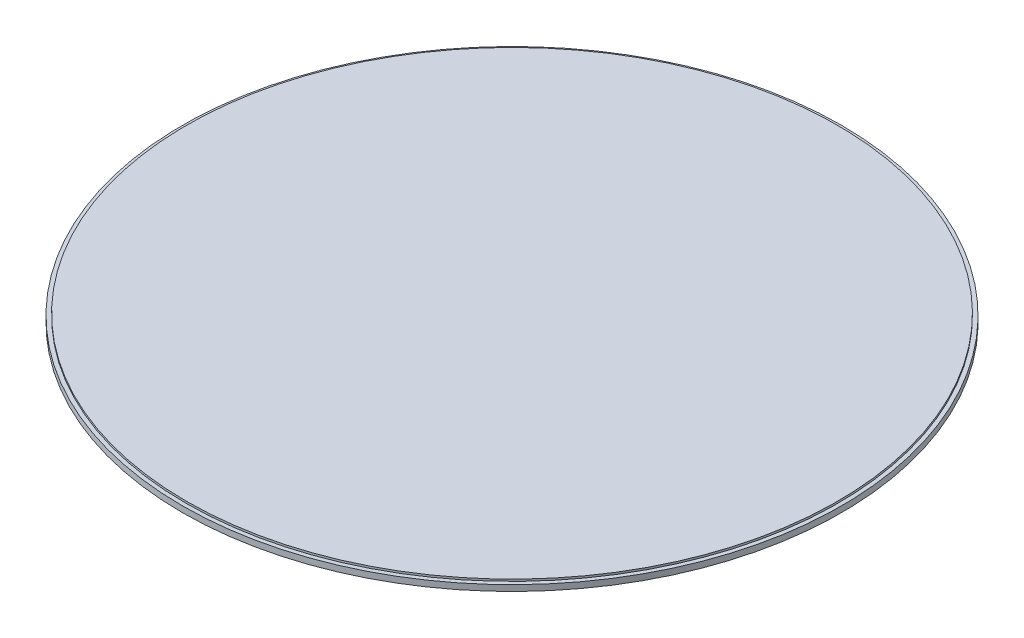
ISO-10303-21;
HEADER;
FILE_DESCRIPTION(('STEP AP214'),'2;1');
FILE_NAME('part.step','',(''),(''),'','','');
FILE_SCHEMA(('AUTOMOTIVE_DESIGN { 1 0 10303 214 1 1 1 1 }'));
ENDSEC;
DATA;
#1=APPLICATION_CONTEXT('core data for automotive mechanical design processes');
#2=APPLICATION_PROTOCOL_DEFINITION('international standard','automotive_design',2000,#1);
#3=PRODUCT_CONTEXT('',#1,'mechanical');
#4=PRODUCT('Part','Part','',(#3));
#5=PRODUCT_RELATED_PRODUCT_CATEGORY('part','',(#4));
#6=PRODUCT_DEFINITION_FORMATION('','',#4);
#7=PRODUCT_DEFINITION_CONTEXT('part definition',#1,'design');
#8=PRODUCT_DEFINITION('design','',#6,#7);
#9=PRODUCT_DEFINITION_SHAPE('','',#8);
#10=(LENGTH_UNIT() NAMED_UNIT(*) SI_UNIT(.MILLI.,.METRE.));
#11=(NAMED_UNIT(*) PLANE_ANGLE_UNIT() SI_UNIT($,.RADIAN.));
#12=(NAMED_UNIT(*) SI_UNIT($,.STERADIAN.) SOLID_ANGLE_UNIT());
#13=UNCERTAINTY_MEASURE_WITH_UNIT(LENGTH_MEASURE(1.E-05),#10,'distance_accuracy_value','');
#14=(GEOMETRIC_REPRESENTATION_CONTEXT(3) GLOBAL_UNCERTAINTY_ASSIGNED_CONTEXT((#13)) GLOBAL_UNIT_ASSIGNED_CONTEXT((#10,
#11,#12)) REPRESENTATION_CONTEXT('',''));
#15=CARTESIAN_POINT('',(0.,0.,0.));
#16=DIRECTION('',(0.,0.,1.));
#17=DIRECTION('',(1.,0.,0.));
#18=AXIS2_PLACEMENT_3D('',#15,#16,#17);
#19=CARTESIAN_POINT('',(-46.3030631686226,0.,6.60291142255023));
#20=DIRECTION('',(0.,1.,0.));
#21=DIRECTION('',(0.,0.,1.));
#22=AXIS2_PLACEMENT_3D('',#19,#20,#21);
#23=CYLINDRICAL_SURFACE('',#22,41.55);
#24=CARTESIAN_POINT('',(-46.3030631686226,0.,6.60291142255023));
#25=DIRECTION('',(0.,1.,0.));
#26=DIRECTION('',(0.,0.,1.));
#27=AXIS2_PLACEMENT_3D('',#24,#25,#26);
#28=CIRCLE('',#27,41.55);
#29=CARTESIAN_POINT('',(-46.3030631686226,0.,48.1529114225502));
#30=VERTEX_POINT('',#29);
#31=EDGE_CURVE('E10',#30,#30,#28,.T.);
#32=ORIENTED_EDGE('',*,*,#31,.T.);
#33=EDGE_LOOP('',(#32));
#34=FACE_BOUND('',#33,.T.);
#35=CARTESIAN_POINT('',(-46.3030631686226,0.75,6.60291142255022));
#36=DIRECTION('',(0.,1.,0.));
#37=DIRECTION('',(0.,0.,1.));
#38=AXIS2_PLACEMENT_3D('',#35,#36,#37);
#39=CIRCLE('',#38,41.55);
#40=CARTESIAN_POINT('',(-46.3030631686226,0.75,48.1529114225502));
#41=VERTEX_POINT('',#40);
#42=EDGE_CURVE('E39',#41,#41,#39,.T.);
#43=ORIENTED_EDGE('',*,*,#42,.F.);
#44=EDGE_LOOP('',(#43));
#45=FACE_BOUND('',#44,.T.);
#46=ADVANCED_FACE('F32',(#34,#45),#23,.T.);
#47=CARTESIAN_POINT('',(-46.3030631686226,0.,6.60291142255023));
#48=DIRECTION('',(0.,1.,0.));
#49=DIRECTION('',(0.,0.,1.));
#50=AXIS2_PLACEMENT_3D('',#47,#48,#49);
#51=PLANE('',#50);
#52=ORIENTED_EDGE('',*,*,#31,.F.);
#53=EDGE_LOOP('',(#52));
#54=FACE_BOUND('',#53,.T.);
#55=ADVANCED_FACE('F34',(#54),#51,.F.);
#56=CARTESIAN_POINT('',(-46.3030631686226,0.75,6.60291142255022));
#57=DIRECTION('',(0.,1.,0.));
#58=DIRECTION('',(0.,0.,1.));
#59=AXIS2_PLACEMENT_3D('',#56,#57,#58);
#60=PLANE('',#59);
#61=CARTESIAN_POINT('',(-46.3030631686226,0.75,6.60291142255022));
#62=DIRECTION('',(0.,1.,0.));
#63=DIRECTION('',(0.,0.,1.));
#64=AXIS2_PLACEMENT_3D('',#61,#62,#63);
#65=CIRCLE('',#64,41.05);
#66=CARTESIAN_POINT('',(-46.3030631686226,0.75,47.6529114225502));
#67=VERTEX_POINT('',#66);
#68=EDGE_CURVE('E43',#67,#67,#65,.T.);
#69=ORIENTED_EDGE('',*,*,#68,.F.);
#70=EDGE_LOOP('',(#69));
#71=FACE_BOUND('',#70,.T.);
#72=ORIENTED_EDGE('',*,*,#42,.T.);
#73=EDGE_LOOP('',(#72));
#74=FACE_BOUND('',#73,.T.);
#75=ADVANCED_FACE('F57',(#71,#74),#60,.T.);
#76=CARTESIAN_POINT('',(-46.3030631686226,0.75,6.60291142255022));
#77=DIRECTION('',(0.,1.,0.));
#78=DIRECTION('',(0.,0.,1.));
#79=AXIS2_PLACEMENT_3D('',#76,#77,#78);
#80=CYLINDRICAL_SURFACE('',#79,41.05);
#81=ORIENTED_EDGE('',*,*,#68,.T.);
#82=EDGE_LOOP('',(#81));
#83=FACE_BOUND('',#82,.T.);
#84=CARTESIAN_POINT('',(-46.3030631686226,1.,6.60291142255022));
#85=DIRECTION('',(0.,1.,0.));
#86=DIRECTION('',(0.,0.,1.));
#87=AXIS2_PLACEMENT_3D('',#84,#85,#86);
#88=CIRCLE('',#87,41.05);
#89=CARTESIAN_POINT('',(-46.3030631686226,1.,47.6529114225502));
#90=VERTEX_POINT('',#89);
#91=EDGE_CURVE('E47',#90,#90,#88,.T.);
#92=ORIENTED_EDGE('',*,*,#91,.F.);
#93=EDGE_LOOP('',(#92));
#94=FACE_BOUND('',#93,.T.);
#95=ADVANCED_FACE('F55',(#83,#94),#80,.T.);
#96=CARTESIAN_POINT('',(-46.3030631686226,1.,6.60291142255023));
#97=DIRECTION('',(0.,1.,0.));
#98=DIRECTION('',(0.,0.,1.));
#99=AXIS2_PLACEMENT_3D('',#96,#97,#98);
#100=PLANE('',#99);
#101=ORIENTED_EDGE('',*,*,#91,.T.);
#102=EDGE_LOOP('',(#101));
#103=FACE_BOUND('',#102,.T.);
#104=ADVANCED_FACE('F53',(#103),#100,.T.);
#105=CLOSED_SHELL('',(#46,#55,#75,#95,#104));
#106=MANIFOLD_SOLID_BREP('B2',#105);
#107=ADVANCED_BREP_SHAPE_REPRESENTATION('',(#18,#106),#14);
#108=SHAPE_DEFINITION_REPRESENTATION(#9,#107);
ENDSEC;
END-ISO-10303-21;
